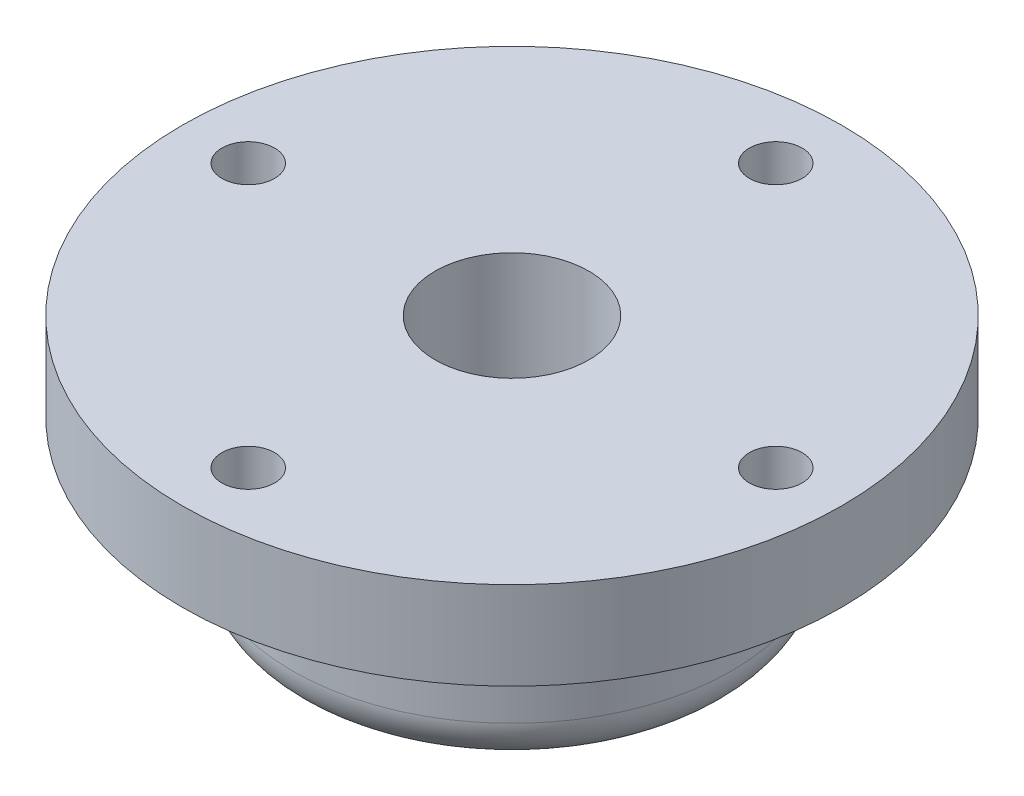
ISO-10303-21;
HEADER;
FILE_DESCRIPTION(('STEP AP214'),'2;1');
FILE_NAME('part.step','',(''),(''),'','','');
FILE_SCHEMA(('AUTOMOTIVE_DESIGN { 1 0 10303 214 1 1 1 1 }'));
ENDSEC;
DATA;
#1=APPLICATION_CONTEXT('core data for automotive mechanical design processes');
#2=APPLICATION_PROTOCOL_DEFINITION('international standard','automotive_design',2000,#1);
#3=PRODUCT_CONTEXT('',#1,'mechanical');
#4=PRODUCT('Part','Part','',(#3));
#5=PRODUCT_RELATED_PRODUCT_CATEGORY('part','',(#4));
#6=PRODUCT_DEFINITION_FORMATION('','',#4);
#7=PRODUCT_DEFINITION_CONTEXT('part definition',#1,'design');
#8=PRODUCT_DEFINITION('design','',#6,#7);
#9=PRODUCT_DEFINITION_SHAPE('','',#8);
#10=(LENGTH_UNIT() NAMED_UNIT(*) SI_UNIT(.MILLI.,.METRE.));
#11=(NAMED_UNIT(*) PLANE_ANGLE_UNIT() SI_UNIT($,.RADIAN.));
#12=(NAMED_UNIT(*) SI_UNIT($,.STERADIAN.) SOLID_ANGLE_UNIT());
#13=UNCERTAINTY_MEASURE_WITH_UNIT(LENGTH_MEASURE(1.E-05),#10,'distance_accuracy_value','');
#14=(GEOMETRIC_REPRESENTATION_CONTEXT(3) GLOBAL_UNCERTAINTY_ASSIGNED_CONTEXT((#13)) GLOBAL_UNIT_ASSIGNED_CONTEXT((#10,
#11,#12)) REPRESENTATION_CONTEXT('',''));
#15=CARTESIAN_POINT('',(0.,0.,0.));
#16=DIRECTION('',(0.,0.,1.));
#17=DIRECTION('',(1.,0.,0.));
#18=AXIS2_PLACEMENT_3D('',#15,#16,#17);
#19=CARTESIAN_POINT('',(0.,71.893155669241,0.));
#20=DIRECTION('',(0.,1.,0.));
#21=DIRECTION('',(-1.,0.,0.));
#22=AXIS2_PLACEMENT_3D('',#19,#20,#21);
#23=CYLINDRICAL_SURFACE('',#22,50.);
#24=CARTESIAN_POINT('',(0.,17.3597971439698,0.));
#25=DIRECTION('',(0.,1.,0.));
#26=DIRECTION('',(-1.,0.,0.));
#27=AXIS2_PLACEMENT_3D('',#24,#25,#26);
#28=CIRCLE('',#27,50.);
#29=CARTESIAN_POINT('',(-50.,17.3597971439698,0.));
#30=VERTEX_POINT('',#29);
#31=EDGE_CURVE('E12',#30,#30,#28,.T.);
#32=ORIENTED_EDGE('',*,*,#31,.T.);
#33=EDGE_LOOP('',(#32));
#34=FACE_BOUND('',#33,.T.);
#35=CARTESIAN_POINT('',(0.,42.3597971439698,0.));
#36=DIRECTION('',(0.,1.,0.));
#37=DIRECTION('',(-1.,0.,0.));
#38=AXIS2_PLACEMENT_3D('',#35,#36,#37);
#39=CIRCLE('',#38,50.);
#40=CARTESIAN_POINT('',(-50.,42.3597971439698,0.));
#41=VERTEX_POINT('',#40);
#42=EDGE_CURVE('E110',#41,#41,#39,.T.);
#43=ORIENTED_EDGE('',*,*,#42,.F.);
#44=EDGE_LOOP('',(#43));
#45=FACE_BOUND('',#44,.T.);
#46=ADVANCED_FACE('F52',(#34,#45),#23,.T.);
#47=CARTESIAN_POINT('',(50.,7.35979714396982,0.));
#48=DIRECTION('',(0.,1.,0.));
#49=DIRECTION('',(-1.,0.,0.));
#50=AXIS2_PLACEMENT_3D('',#47,#48,#49);
#51=PLANE('',#50);
#52=CARTESIAN_POINT('',(0.,7.35979714396981,0.));
#53=DIRECTION('',(0.,1.,0.));
#54=DIRECTION('',(-1.,0.,0.));
#55=AXIS2_PLACEMENT_3D('',#52,#53,#54);
#56=CIRCLE('',#55,27.5);
#57=CARTESIAN_POINT('',(-27.5,7.35979714396981,0.));
#58=VERTEX_POINT('',#57);
#59=EDGE_CURVE('E66',#58,#58,#56,.T.);
#60=ORIENTED_EDGE('',*,*,#59,.T.);
#61=EDGE_LOOP('',(#60));
#62=FACE_BOUND('',#61,.T.);
#63=CARTESIAN_POINT('',(0.,7.35979714396981,0.));
#64=DIRECTION('',(0.,1.,0.));
#65=DIRECTION('',(-1.,0.,0.));
#66=AXIS2_PLACEMENT_3D('',#63,#64,#65);
#67=CIRCLE('',#66,40.);
#68=CARTESIAN_POINT('',(-40.,7.3597971439698,0.));
#69=VERTEX_POINT('',#68);
#70=EDGE_CURVE('E72',#69,#69,#67,.F.);
#71=ORIENTED_EDGE('',*,*,#70,.T.);
#72=EDGE_LOOP('',(#71));
#73=FACE_BOUND('',#72,.T.);
#74=ADVANCED_FACE('F154',(#62,#73),#51,.F.);
#75=CARTESIAN_POINT('',(0.,71.893155669241,0.));
#76=DIRECTION('',(0.,1.,0.));
#77=DIRECTION('',(-1.,0.,0.));
#78=AXIS2_PLACEMENT_3D('',#75,#76,#77);
#79=CYLINDRICAL_SURFACE('',#78,17.5);
#80=CARTESIAN_POINT('',(0.,17.3597971439698,0.));
#81=DIRECTION('',(0.,1.,0.));
#82=DIRECTION('',(-1.,0.,0.));
#83=AXIS2_PLACEMENT_3D('',#80,#81,#82);
#84=CIRCLE('',#83,17.5);
#85=CARTESIAN_POINT('',(-17.5,17.3597971439698,0.));
#86=VERTEX_POINT('',#85);
#87=EDGE_CURVE('E60',#86,#86,#84,.F.);
#88=ORIENTED_EDGE('',*,*,#87,.T.);
#89=EDGE_LOOP('',(#88));
#90=FACE_BOUND('',#89,.T.);
#91=CARTESIAN_POINT('',(0.,62.3597971439698,0.));
#92=DIRECTION('',(0.,1.,0.));
#93=DIRECTION('',(-1.,0.,0.));
#94=AXIS2_PLACEMENT_3D('',#91,#92,#93);
#95=CIRCLE('',#94,17.5);
#96=CARTESIAN_POINT('',(-17.5,62.3597971439698,0.));
#97=VERTEX_POINT('',#96);
#98=EDGE_CURVE('E78',#97,#97,#95,.T.);
#99=ORIENTED_EDGE('',*,*,#98,.T.);
#100=EDGE_LOOP('',(#99));
#101=FACE_BOUND('',#100,.T.);
#102=ADVANCED_FACE('F134',(#90,#101),#79,.F.);
#103=CARTESIAN_POINT('',(75.,62.3597971439698,0.));
#104=DIRECTION('',(0.,-1.,0.));
#105=DIRECTION('',(1.,0.,0.));
#106=AXIS2_PLACEMENT_3D('',#103,#104,#105);
#107=PLANE('',#106);
#108=CARTESIAN_POINT('',(0.,62.3597971439698,60.));
#109=DIRECTION('',(0.,-1.,0.));
#110=DIRECTION('',(1.,0.,0.));
#111=AXIS2_PLACEMENT_3D('',#108,#109,#110);
#112=CIRCLE('',#111,6.);
#113=CARTESIAN_POINT('',(5.99999999999999,62.3597971439698,60.));
#114=VERTEX_POINT('',#113);
#115=EDGE_CURVE('E83',#114,#114,#112,.F.);
#116=ORIENTED_EDGE('',*,*,#115,.F.);
#117=EDGE_LOOP('',(#116));
#118=FACE_BOUND('',#117,.T.);
#119=CARTESIAN_POINT('',(60.0000000000017,62.3597971439698,1.69428074463191E-12));
#120=DIRECTION('',(0.,-1.,0.));
#121=DIRECTION('',(1.,0.,0.));
#122=AXIS2_PLACEMENT_3D('',#119,#120,#121);
#123=CIRCLE('',#122,6.00000000000133);
#124=CARTESIAN_POINT('',(66.000000000003,62.3597971439698,1.69428074463191E-12));
#125=VERTEX_POINT('',#124);
#126=EDGE_CURVE('E84',#125,#125,#123,.F.);
#127=ORIENTED_EDGE('',*,*,#126,.F.);
#128=EDGE_LOOP('',(#127));
#129=FACE_BOUND('',#128,.T.);
#130=CARTESIAN_POINT('',(3.37960897023502E-12,62.3597971439698,-60.));
#131=DIRECTION('',(0.,-1.,0.));
#132=DIRECTION('',(1.,0.,0.));
#133=AXIS2_PLACEMENT_3D('',#130,#131,#132);
#134=CIRCLE('',#133,6.00000000000364);
#135=CARTESIAN_POINT('',(6.00000000000702,62.3597971439698,-60.));
#136=VERTEX_POINT('',#135);
#137=EDGE_CURVE('E89',#136,#136,#134,.F.);
#138=ORIENTED_EDGE('',*,*,#137,.F.);
#139=EDGE_LOOP('',(#138));
#140=FACE_BOUND('',#139,.T.);
#141=CARTESIAN_POINT('',(-59.9999999999983,62.3597971439698,-1.7016286254268E-12));
#142=DIRECTION('',(0.,-1.,0.));
#143=DIRECTION('',(1.,0.,0.));
#144=AXIS2_PLACEMENT_3D('',#141,#142,#143);
#145=CIRCLE('',#144,6.00000000000272);
#146=CARTESIAN_POINT('',(-53.9999999999956,62.3597971439698,-1.7016286254268E-12));
#147=VERTEX_POINT('',#146);
#148=EDGE_CURVE('E94',#147,#147,#145,.F.);
#149=ORIENTED_EDGE('',*,*,#148,.F.);
#150=EDGE_LOOP('',(#149));
#151=FACE_BOUND('',#150,.T.);
#152=ORIENTED_EDGE('',*,*,#98,.F.);
#153=EDGE_LOOP('',(#152));
#154=FACE_BOUND('',#153,.T.);
#155=CARTESIAN_POINT('',(0.,62.3597971439698,0.));
#156=DIRECTION('',(0.,1.,0.));
#157=DIRECTION('',(-1.,0.,0.));
#158=AXIS2_PLACEMENT_3D('',#155,#156,#157);
#159=CIRCLE('',#158,75.);
#160=CARTESIAN_POINT('',(-75.,62.3597971439698,0.));
#161=VERTEX_POINT('',#160);
#162=EDGE_CURVE('E102',#161,#161,#159,.T.);
#163=ORIENTED_EDGE('',*,*,#162,.T.);
#164=EDGE_LOOP('',(#163));
#165=FACE_BOUND('',#164,.T.);
#166=ADVANCED_FACE('F130',(#118,#129,#140,#151,#154,#165),#107,.F.);
#167=CARTESIAN_POINT('',(0.,71.893155669241,0.));
#168=DIRECTION('',(0.,1.,0.));
#169=DIRECTION('',(-1.,0.,0.));
#170=AXIS2_PLACEMENT_3D('',#167,#168,#169);
#171=CYLINDRICAL_SURFACE('',#170,75.);
#172=ORIENTED_EDGE('',*,*,#162,.F.);
#173=EDGE_LOOP('',(#172));
#174=FACE_BOUND('',#173,.T.);
#175=CARTESIAN_POINT('',(0.,42.3597971439698,0.));
#176=DIRECTION('',(0.,1.,0.));
#177=DIRECTION('',(-1.,0.,0.));
#178=AXIS2_PLACEMENT_3D('',#175,#176,#177);
#179=CIRCLE('',#178,75.);
#180=CARTESIAN_POINT('',(-75.,42.3597971439698,0.));
#181=VERTEX_POINT('',#180);
#182=EDGE_CURVE('E106',#181,#181,#179,.T.);
#183=ORIENTED_EDGE('',*,*,#182,.T.);
#184=EDGE_LOOP('',(#183));
#185=FACE_BOUND('',#184,.T.);
#186=ADVANCED_FACE('F133',(#174,#185),#171,.T.);
#187=CARTESIAN_POINT('',(75.,42.3597971439698,0.));
#188=DIRECTION('',(0.,1.,0.));
#189=DIRECTION('',(-1.,0.,0.));
#190=AXIS2_PLACEMENT_3D('',#187,#188,#189);
#191=PLANE('',#190);
#192=CARTESIAN_POINT('',(0.,42.3597971439698,60.));
#193=DIRECTION('',(0.,1.,0.));
#194=DIRECTION('',(-1.,0.,0.));
#195=AXIS2_PLACEMENT_3D('',#192,#193,#194);
#196=CIRCLE('',#195,6.);
#197=CARTESIAN_POINT('',(-6.00000000000001,42.3597971439698,60.));
#198=VERTEX_POINT('',#197);
#199=EDGE_CURVE('E79',#198,#198,#196,.F.);
#200=ORIENTED_EDGE('',*,*,#199,.F.);
#201=EDGE_LOOP('',(#200));
#202=FACE_BOUND('',#201,.T.);
#203=CARTESIAN_POINT('',(60.0000000000017,42.3597971439698,1.69428074463191E-12));
#204=DIRECTION('',(0.,1.,0.));
#205=DIRECTION('',(-1.,0.,0.));
#206=AXIS2_PLACEMENT_3D('',#203,#204,#205);
#207=CIRCLE('',#206,6.00000000000133);
#208=CARTESIAN_POINT('',(54.0000000000004,42.3597971439698,1.69428074463191E-12));
#209=VERTEX_POINT('',#208);
#210=EDGE_CURVE('E85',#209,#209,#207,.F.);
#211=ORIENTED_EDGE('',*,*,#210,.F.);
#212=EDGE_LOOP('',(#211));
#213=FACE_BOUND('',#212,.T.);
#214=CARTESIAN_POINT('',(3.38248021723672E-12,42.3597971439698,-60.));
#215=DIRECTION('',(0.,1.,0.));
#216=DIRECTION('',(-1.,0.,0.));
#217=AXIS2_PLACEMENT_3D('',#214,#215,#216);
#218=CIRCLE('',#217,6.00000000000364);
#219=CARTESIAN_POINT('',(-6.00000000000026,42.3597971439698,-60.));
#220=VERTEX_POINT('',#219);
#221=EDGE_CURVE('E90',#220,#220,#218,.F.);
#222=ORIENTED_EDGE('',*,*,#221,.F.);
#223=EDGE_LOOP('',(#222));
#224=FACE_BOUND('',#223,.T.);
#225=CARTESIAN_POINT('',(-59.9999999999983,42.3597971439698,-1.7016286254268E-12));
#226=DIRECTION('',(0.,1.,0.));
#227=DIRECTION('',(-1.,0.,0.));
#228=AXIS2_PLACEMENT_3D('',#225,#226,#227);
#229=CIRCLE('',#228,6.00000000000272);
#230=CARTESIAN_POINT('',(-66.000000000001,42.3597971439698,-1.7016286254268E-12));
#231=VERTEX_POINT('',#230);
#232=EDGE_CURVE('E95',#231,#231,#229,.F.);
#233=ORIENTED_EDGE('',*,*,#232,.F.);
#234=EDGE_LOOP('',(#233));
#235=FACE_BOUND('',#234,.T.);
#236=ORIENTED_EDGE('',*,*,#182,.F.);
#237=EDGE_LOOP('',(#236));
#238=FACE_BOUND('',#237,.T.);
#239=ORIENTED_EDGE('',*,*,#42,.T.);
#240=EDGE_LOOP('',(#239));
#241=FACE_BOUND('',#240,.T.);
#242=ADVANCED_FACE('F143',(#202,#213,#224,#235,#238,#241),#191,.F.);
#243=CARTESIAN_POINT('',(-59.9999999999983,7.35979714396978,-1.7016286254268E-12));
#244=DIRECTION('',(0.,1.,0.));
#245=DIRECTION('',(-1.,0.,0.));
#246=AXIS2_PLACEMENT_3D('',#243,#244,#245);
#247=CYLINDRICAL_SURFACE('',#246,6.00000000000272);
#248=ORIENTED_EDGE('',*,*,#232,.T.);
#249=EDGE_LOOP('',(#248));
#250=FACE_BOUND('',#249,.T.);
#251=ORIENTED_EDGE('',*,*,#148,.T.);
#252=EDGE_LOOP('',(#251));
#253=FACE_BOUND('',#252,.T.);
#254=ADVANCED_FACE('F128',(#250,#253),#247,.F.);
#255=CARTESIAN_POINT('',(3.38750489948969E-12,7.35979714396978,-60.));
#256=DIRECTION('',(0.,1.,0.));
#257=DIRECTION('',(-1.,0.,0.));
#258=AXIS2_PLACEMENT_3D('',#255,#256,#257);
#259=CYLINDRICAL_SURFACE('',#258,6.00000000000364);
#260=ORIENTED_EDGE('',*,*,#221,.T.);
#261=EDGE_LOOP('',(#260));
#262=FACE_BOUND('',#261,.T.);
#263=ORIENTED_EDGE('',*,*,#137,.T.);
#264=EDGE_LOOP('',(#263));
#265=FACE_BOUND('',#264,.T.);
#266=ADVANCED_FACE('F182',(#262,#265),#259,.F.);
#267=CARTESIAN_POINT('',(60.0000000000017,7.35979714396979,1.69428074463191E-12));
#268=DIRECTION('',(0.,1.,0.));
#269=DIRECTION('',(-1.,0.,0.));
#270=AXIS2_PLACEMENT_3D('',#267,#268,#269);
#271=CYLINDRICAL_SURFACE('',#270,6.00000000000133);
#272=ORIENTED_EDGE('',*,*,#210,.T.);
#273=EDGE_LOOP('',(#272));
#274=FACE_BOUND('',#273,.T.);
#275=ORIENTED_EDGE('',*,*,#126,.T.);
#276=EDGE_LOOP('',(#275));
#277=FACE_BOUND('',#276,.T.);
#278=ADVANCED_FACE('F171',(#274,#277),#271,.F.);
#279=CARTESIAN_POINT('',(0.,7.35979714396978,60.));
#280=DIRECTION('',(0.,1.,0.));
#281=DIRECTION('',(-1.,0.,0.));
#282=AXIS2_PLACEMENT_3D('',#279,#280,#281);
#283=CYLINDRICAL_SURFACE('',#282,6.);
#284=ORIENTED_EDGE('',*,*,#199,.T.);
#285=EDGE_LOOP('',(#284));
#286=FACE_BOUND('',#285,.T.);
#287=ORIENTED_EDGE('',*,*,#115,.T.);
#288=EDGE_LOOP('',(#287));
#289=FACE_BOUND('',#288,.T.);
#290=ADVANCED_FACE('F164',(#286,#289),#283,.F.);
#291=CARTESIAN_POINT('',(0.,17.3597971439698,0.));
#292=DIRECTION('',(0.,1.,0.));
#293=DIRECTION('',(-1.,0.,0.));
#294=AXIS2_PLACEMENT_3D('',#291,#292,#293);
#295=TOROIDAL_SURFACE('',#294,27.5,10.);
#296=ORIENTED_EDGE('',*,*,#87,.F.);
#297=EDGE_LOOP('',(#296));
#298=FACE_BOUND('',#297,.T.);
#299=ORIENTED_EDGE('',*,*,#59,.F.);
#300=EDGE_LOOP('',(#299));
#301=FACE_BOUND('',#300,.T.);
#302=ADVANCED_FACE('F162',(#298,#301),#295,.T.);
#303=CARTESIAN_POINT('',(0.,17.3597971439698,0.));
#304=DIRECTION('',(0.,1.,0.));
#305=DIRECTION('',(-1.,0.,0.));
#306=AXIS2_PLACEMENT_3D('',#303,#304,#305);
#307=TOROIDAL_SURFACE('',#306,40.,10.);
#308=ORIENTED_EDGE('',*,*,#70,.F.);
#309=EDGE_LOOP('',(#308));
#310=FACE_BOUND('',#309,.T.);
#311=ORIENTED_EDGE('',*,*,#31,.F.);
#312=EDGE_LOOP('',(#311));
#313=FACE_BOUND('',#312,.T.);
#314=ADVANCED_FACE('F54',(#310,#313),#307,.T.);
#315=CLOSED_SHELL('',(#46,#74,#102,#166,#186,#242,#254,#266,#278,#290,#302,#314));
#316=MANIFOLD_SOLID_BREP('B2',#315);
#317=ADVANCED_BREP_SHAPE_REPRESENTATION('',(#18,#316),#14);
#318=SHAPE_DEFINITION_REPRESENTATION(#9,#317);
ENDSEC;
END-ISO-10303-21;
